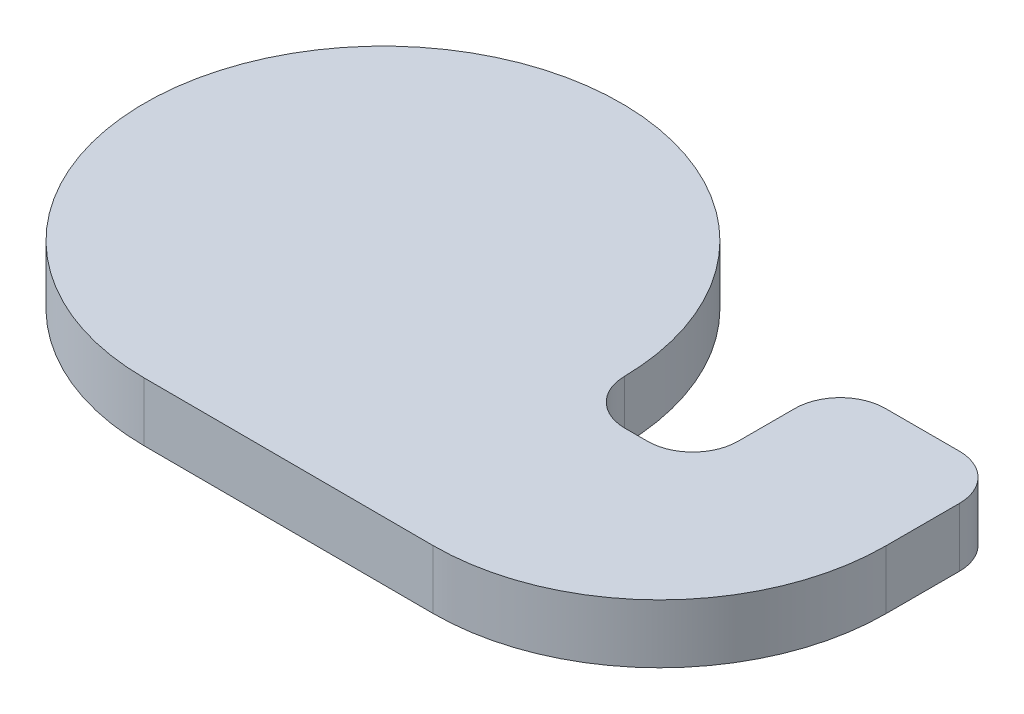
ISO-10303-21;
HEADER;
FILE_DESCRIPTION(('STEP AP214'),'2;1');
FILE_NAME('part.step','',(''),(''),'','','');
FILE_SCHEMA(('AUTOMOTIVE_DESIGN { 1 0 10303 214 1 1 1 1 }'));
ENDSEC;
DATA;
#1=APPLICATION_CONTEXT('core data for automotive mechanical design processes');
#2=APPLICATION_PROTOCOL_DEFINITION('international standard','automotive_design',2000,#1);
#3=PRODUCT_CONTEXT('',#1,'mechanical');
#4=PRODUCT('Part','Part','',(#3));
#5=PRODUCT_RELATED_PRODUCT_CATEGORY('part','',(#4));
#6=PRODUCT_DEFINITION_FORMATION('','',#4);
#7=PRODUCT_DEFINITION_CONTEXT('part definition',#1,'design');
#8=PRODUCT_DEFINITION('design','',#6,#7);
#9=PRODUCT_DEFINITION_SHAPE('','',#8);
#10=(LENGTH_UNIT() NAMED_UNIT(*) SI_UNIT(.MILLI.,.METRE.));
#11=(NAMED_UNIT(*) PLANE_ANGLE_UNIT() SI_UNIT($,.RADIAN.));
#12=(NAMED_UNIT(*) SI_UNIT($,.STERADIAN.) SOLID_ANGLE_UNIT());
#13=UNCERTAINTY_MEASURE_WITH_UNIT(LENGTH_MEASURE(1.E-05),#10,'distance_accuracy_value','');
#14=(GEOMETRIC_REPRESENTATION_CONTEXT(3) GLOBAL_UNCERTAINTY_ASSIGNED_CONTEXT((#13)) GLOBAL_UNIT_ASSIGNED_CONTEXT((#10,
#11,#12)) REPRESENTATION_CONTEXT('',''));
#15=CARTESIAN_POINT('',(0.,0.,0.));
#16=DIRECTION('',(0.,0.,1.));
#17=DIRECTION('',(1.,0.,0.));
#18=AXIS2_PLACEMENT_3D('',#15,#16,#17);
#19=CARTESIAN_POINT('',(37.3962325360071,-2.8,1.83338002798846));
#20=DIRECTION('',(0.,0.,1.));
#21=DIRECTION('',(1.,0.,0.));
#22=AXIS2_PLACEMENT_3D('',#19,#20,#21);
#23=PLANE('',#22);
#24=DIRECTION('',(1.,0.,0.));
#25=VECTOR('',#24,1.);
#26=CARTESIAN_POINT('',(37.3962325360071,-0.2,1.83338002798846));
#27=LINE('',#26,#25);
#28=CARTESIAN_POINT('',(37.3962325360071,-0.2,1.83338002798846));
#29=VERTEX_POINT('',#28);
#30=CARTESIAN_POINT('',(38.3933171153571,-0.2,1.83338002798846));
#31=VERTEX_POINT('',#30);
#32=EDGE_CURVE('E147',#29,#31,#27,.T.);
#33=ORIENTED_EDGE('',*,*,#32,.T.);
#34=DIRECTION('',(0.,1.,0.));
#35=VECTOR('',#34,1.);
#36=CARTESIAN_POINT('',(38.3933171153571,-2.8,1.83338002798846));
#37=LINE('',#36,#35);
#38=CARTESIAN_POINT('',(38.3933171153571,-2.8,1.83338002798846));
#39=VERTEX_POINT('',#38);
#40=EDGE_CURVE('E11',#39,#31,#37,.T.);
#41=ORIENTED_EDGE('',*,*,#40,.F.);
#42=DIRECTION('',(1.,0.,0.));
#43=VECTOR('',#42,1.);
#44=CARTESIAN_POINT('',(37.3962325360071,-2.8,1.83338002798846));
#45=LINE('',#44,#43);
#46=CARTESIAN_POINT('',(37.3962325360071,-2.8,1.83338002798846));
#47=VERTEX_POINT('',#46);
#48=EDGE_CURVE('E171',#47,#39,#45,.T.);
#49=ORIENTED_EDGE('',*,*,#48,.F.);
#50=DIRECTION('',(0.,1.,0.));
#51=VECTOR('',#50,1.);
#52=CARTESIAN_POINT('',(37.3962325360071,-2.8,1.83338002798846));
#53=LINE('',#52,#51);
#54=EDGE_CURVE('E49',#47,#29,#53,.T.);
#55=ORIENTED_EDGE('',*,*,#54,.T.);
#56=EDGE_LOOP('',(#33,#41,#49,#55));
#57=FACE_BOUND('',#56,.T.);
#58=ADVANCED_FACE('F33',(#57),#23,.F.);
#59=CARTESIAN_POINT('',(38.3933171153572,-2.8,-0.166619972011536));
#60=DIRECTION('',(0.,1.,0.));
#61=DIRECTION('',(0.,0.,1.));
#62=AXIS2_PLACEMENT_3D('',#59,#60,#61);
#63=CYLINDRICAL_SURFACE('',#62,2.);
#64=CARTESIAN_POINT('',(38.3933171153572,-0.2,-0.166619972011536));
#65=DIRECTION('',(0.,1.,0.));
#66=DIRECTION('',(0.,0.,1.));
#67=AXIS2_PLACEMENT_3D('',#64,#65,#66);
#68=CIRCLE('',#67,2.);
#69=CARTESIAN_POINT('',(40.3933171153572,-0.2,-0.16661997201155));
#70=VERTEX_POINT('',#69);
#71=EDGE_CURVE('E149',#31,#70,#68,.T.);
#72=ORIENTED_EDGE('',*,*,#71,.T.);
#73=DIRECTION('',(0.,1.,0.));
#74=VECTOR('',#73,1.);
#75=CARTESIAN_POINT('',(40.3933171153572,-2.8,-0.16661997201155));
#76=LINE('',#75,#74);
#77=CARTESIAN_POINT('',(40.3933171153572,-2.8,-0.16661997201155));
#78=VERTEX_POINT('',#77);
#79=EDGE_CURVE('E41',#78,#70,#76,.T.);
#80=ORIENTED_EDGE('',*,*,#79,.F.);
#81=CARTESIAN_POINT('',(38.3933171153572,-2.8,-0.166619972011536));
#82=DIRECTION('',(0.,1.,0.));
#83=DIRECTION('',(0.,0.,1.));
#84=AXIS2_PLACEMENT_3D('',#81,#82,#83);
#85=CIRCLE('',#84,2.);
#86=EDGE_CURVE('E96',#39,#78,#85,.T.);
#87=ORIENTED_EDGE('',*,*,#86,.F.);
#88=ORIENTED_EDGE('',*,*,#40,.T.);
#89=EDGE_LOOP('',(#72,#80,#87,#88));
#90=FACE_BOUND('',#89,.T.);
#91=ADVANCED_FACE('F234',(#90),#63,.F.);
#92=CARTESIAN_POINT('',(40.3933171153572,-2.8,-0.16661997201155));
#93=DIRECTION('',(1.,0.,0.));
#94=DIRECTION('',(0.,0.,-1.));
#95=AXIS2_PLACEMENT_3D('',#92,#93,#94);
#96=PLANE('',#95);
#97=DIRECTION('',(0.,0.,-1.));
#98=VECTOR('',#97,1.);
#99=CARTESIAN_POINT('',(40.3933171153572,-0.2,-0.16661997201155));
#100=LINE('',#99,#98);
#101=CARTESIAN_POINT('',(40.3933171153572,-0.2,-2.68092068018292));
#102=VERTEX_POINT('',#101);
#103=EDGE_CURVE('E151',#70,#102,#100,.T.);
#104=ORIENTED_EDGE('',*,*,#103,.T.);
#105=DIRECTION('',(0.,1.,0.));
#106=VECTOR('',#105,1.);
#107=CARTESIAN_POINT('',(40.3933171153572,-2.8,-2.68092068018292));
#108=LINE('',#107,#106);
#109=CARTESIAN_POINT('',(40.3933171153572,-2.8,-2.68092068018292));
#110=VERTEX_POINT('',#109);
#111=EDGE_CURVE('E186',#110,#102,#108,.T.);
#112=ORIENTED_EDGE('',*,*,#111,.F.);
#113=DIRECTION('',(0.,0.,-1.));
#114=VECTOR('',#113,1.);
#115=CARTESIAN_POINT('',(40.3933171153572,-2.8,-0.16661997201155));
#116=LINE('',#115,#114);
#117=EDGE_CURVE('E194',#78,#110,#116,.T.);
#118=ORIENTED_EDGE('',*,*,#117,.F.);
#119=ORIENTED_EDGE('',*,*,#79,.T.);
#120=EDGE_LOOP('',(#104,#112,#118,#119));
#121=FACE_BOUND('',#120,.T.);
#122=ADVANCED_FACE('F192',(#121),#96,.F.);
#123=CARTESIAN_POINT('',(42.3933171153572,-2.8,-2.68092068018294));
#124=DIRECTION('',(0.,1.,0.));
#125=DIRECTION('',(0.,0.,1.));
#126=AXIS2_PLACEMENT_3D('',#123,#124,#125);
#127=CYLINDRICAL_SURFACE('',#126,2.);
#128=CARTESIAN_POINT('',(42.3933171153572,-0.2,-2.68092068018294));
#129=DIRECTION('',(0.,-1.,0.));
#130=DIRECTION('',(0.,0.,-1.));
#131=AXIS2_PLACEMENT_3D('',#128,#129,#130);
#132=CIRCLE('',#131,2.);
#133=CARTESIAN_POINT('',(42.3933171153572,-0.2,-4.68092068018294));
#134=VERTEX_POINT('',#133);
#135=EDGE_CURVE('E153',#102,#134,#132,.T.);
#136=ORIENTED_EDGE('',*,*,#135,.T.);
#137=DIRECTION('',(0.,1.,0.));
#138=VECTOR('',#137,1.);
#139=CARTESIAN_POINT('',(42.3933171153572,-2.8,-4.68092068018294));
#140=LINE('',#139,#138);
#141=CARTESIAN_POINT('',(42.3933171153572,-2.8,-4.68092068018294));
#142=VERTEX_POINT('',#141);
#143=EDGE_CURVE('E183',#142,#134,#140,.T.);
#144=ORIENTED_EDGE('',*,*,#143,.F.);
#145=CARTESIAN_POINT('',(42.3933171153572,-2.8,-2.68092068018294));
#146=DIRECTION('',(0.,-1.,0.));
#147=DIRECTION('',(0.,0.,-1.));
#148=AXIS2_PLACEMENT_3D('',#145,#146,#147);
#149=CIRCLE('',#148,2.);
#150=EDGE_CURVE('E211',#110,#142,#149,.T.);
#151=ORIENTED_EDGE('',*,*,#150,.F.);
#152=ORIENTED_EDGE('',*,*,#111,.T.);
#153=EDGE_LOOP('',(#136,#144,#151,#152));
#154=FACE_BOUND('',#153,.T.);
#155=ADVANCED_FACE('F202',(#154),#127,.T.);
#156=CARTESIAN_POINT('',(42.3933171153572,-2.8,-4.68092068018294));
#157=DIRECTION('',(0.,0.,1.));
#158=DIRECTION('',(1.,0.,0.));
#159=AXIS2_PLACEMENT_3D('',#156,#157,#158);
#160=PLANE('',#159);
#161=DIRECTION('',(1.,0.,0.));
#162=VECTOR('',#161,1.);
#163=CARTESIAN_POINT('',(42.3933171153572,-0.2,-4.68092068018294));
#164=LINE('',#163,#162);
#165=CARTESIAN_POINT('',(45.6634384394627,-0.2,-4.68092068018294));
#166=VERTEX_POINT('',#165);
#167=EDGE_CURVE('E155',#134,#166,#164,.T.);
#168=ORIENTED_EDGE('',*,*,#167,.T.);
#169=DIRECTION('',(0.,1.,0.));
#170=VECTOR('',#169,1.);
#171=CARTESIAN_POINT('',(45.6634384394627,-2.8,-4.68092068018294));
#172=LINE('',#171,#170);
#173=CARTESIAN_POINT('',(45.6634384394627,-2.8,-4.68092068018294));
#174=VERTEX_POINT('',#173);
#175=EDGE_CURVE('E180',#174,#166,#172,.T.);
#176=ORIENTED_EDGE('',*,*,#175,.F.);
#177=DIRECTION('',(1.,0.,0.));
#178=VECTOR('',#177,1.);
#179=CARTESIAN_POINT('',(42.3933171153572,-2.8,-4.68092068018294));
#180=LINE('',#179,#178);
#181=EDGE_CURVE('E208',#142,#174,#180,.T.);
#182=ORIENTED_EDGE('',*,*,#181,.F.);
#183=ORIENTED_EDGE('',*,*,#143,.T.);
#184=EDGE_LOOP('',(#168,#176,#182,#183));
#185=FACE_BOUND('',#184,.T.);
#186=ADVANCED_FACE('F206',(#185),#160,.F.);
#187=CARTESIAN_POINT('',(45.6634384394627,-2.8,-2.68092068018294));
#188=DIRECTION('',(0.,1.,0.));
#189=DIRECTION('',(0.,0.,1.));
#190=AXIS2_PLACEMENT_3D('',#187,#188,#189);
#191=CYLINDRICAL_SURFACE('',#190,2.);
#192=CARTESIAN_POINT('',(45.6634384394627,-0.2,-2.68092068018294));
#193=DIRECTION('',(0.,-1.,0.));
#194=DIRECTION('',(0.,0.,-1.));
#195=AXIS2_PLACEMENT_3D('',#192,#193,#194);
#196=CIRCLE('',#195,2.);
#197=CARTESIAN_POINT('',(47.6634384394627,-0.2,-2.68092068018292));
#198=VERTEX_POINT('',#197);
#199=EDGE_CURVE('E157',#166,#198,#196,.T.);
#200=ORIENTED_EDGE('',*,*,#199,.T.);
#201=DIRECTION('',(0.,1.,0.));
#202=VECTOR('',#201,1.);
#203=CARTESIAN_POINT('',(47.6634384394627,-2.8,-2.68092068018292));
#204=LINE('',#203,#202);
#205=CARTESIAN_POINT('',(47.6634384394627,-2.8,-2.68092068018292));
#206=VERTEX_POINT('',#205);
#207=EDGE_CURVE('E177',#206,#198,#204,.T.);
#208=ORIENTED_EDGE('',*,*,#207,.F.);
#209=CARTESIAN_POINT('',(45.6634384394627,-2.8,-2.68092068018294));
#210=DIRECTION('',(0.,-1.,0.));
#211=DIRECTION('',(0.,0.,-1.));
#212=AXIS2_PLACEMENT_3D('',#209,#210,#211);
#213=CIRCLE('',#212,2.);
#214=EDGE_CURVE('E210',#174,#206,#213,.T.);
#215=ORIENTED_EDGE('',*,*,#214,.F.);
#216=ORIENTED_EDGE('',*,*,#175,.T.);
#217=EDGE_LOOP('',(#200,#208,#215,#216));
#218=FACE_BOUND('',#217,.T.);
#219=ADVANCED_FACE('F250',(#218),#191,.T.);
#220=CARTESIAN_POINT('',(47.6634384394627,-2.8,-2.68092068018292));
#221=DIRECTION('',(-1.,0.,0.));
#222=DIRECTION('',(0.,0.,1.));
#223=AXIS2_PLACEMENT_3D('',#220,#221,#222);
#224=PLANE('',#223);
#225=DIRECTION('',(0.,0.,1.));
#226=VECTOR('',#225,1.);
#227=CARTESIAN_POINT('',(47.6634384394627,-0.2,-2.68092068018292));
#228=LINE('',#227,#226);
#229=CARTESIAN_POINT('',(47.6634384394627,-0.2,0.56581777710763));
#230=VERTEX_POINT('',#229);
#231=EDGE_CURVE('E159',#198,#230,#228,.T.);
#232=ORIENTED_EDGE('',*,*,#231,.T.);
#233=DIRECTION('',(0.,1.,0.));
#234=VECTOR('',#233,1.);
#235=CARTESIAN_POINT('',(47.6634384394627,-2.8,0.56581777710763));
#236=LINE('',#235,#234);
#237=CARTESIAN_POINT('',(47.6634384394627,-2.8,0.56581777710763));
#238=VERTEX_POINT('',#237);
#239=EDGE_CURVE('E175',#238,#230,#236,.T.);
#240=ORIENTED_EDGE('',*,*,#239,.F.);
#241=DIRECTION('',(0.,0.,1.));
#242=VECTOR('',#241,1.);
#243=CARTESIAN_POINT('',(47.6634384394627,-2.8,-2.68092068018292));
#244=LINE('',#243,#242);
#245=EDGE_CURVE('E213',#206,#238,#244,.T.);
#246=ORIENTED_EDGE('',*,*,#245,.F.);
#247=ORIENTED_EDGE('',*,*,#207,.T.);
#248=EDGE_LOOP('',(#232,#240,#246,#247));
#249=FACE_BOUND('',#248,.T.);
#250=ADVANCED_FACE('F253',(#249),#224,.F.);
#251=CARTESIAN_POINT('',(37.6634384394627,-2.8,0.565817777107701));
#252=DIRECTION('',(0.,1.,0.));
#253=DIRECTION('',(0.,0.,1.));
#254=AXIS2_PLACEMENT_3D('',#251,#252,#253);
#255=CYLINDRICAL_SURFACE('',#254,10.);
#256=CARTESIAN_POINT('',(37.6634384394627,-0.2,0.565817777107701));
#257=DIRECTION('',(0.,1.,0.));
#258=DIRECTION('',(0.,0.,1.));
#259=AXIS2_PLACEMENT_3D('',#256,#257,#258);
#260=CIRCLE('',#259,10.);
#261=CARTESIAN_POINT('',(37.6379759167613,-0.2,10.565785360052));
#262=VERTEX_POINT('',#261);
#263=EDGE_CURVE('E162',#262,#230,#260,.T.);
#264=ORIENTED_EDGE('',*,*,#263,.F.);
#265=DIRECTION('',(0.,1.,0.));
#266=VECTOR('',#265,1.);
#267=CARTESIAN_POINT('',(37.6379759167613,-2.8,10.565785360052));
#268=LINE('',#267,#266);
#269=CARTESIAN_POINT('',(37.6379759167613,-2.8,10.565785360052));
#270=VERTEX_POINT('',#269);
#271=EDGE_CURVE('E130',#270,#262,#268,.T.);
#272=ORIENTED_EDGE('',*,*,#271,.F.);
#273=CARTESIAN_POINT('',(37.6634384394627,-2.8,0.565817777107701));
#274=DIRECTION('',(0.,1.,0.));
#275=DIRECTION('',(0.,0.,1.));
#276=AXIS2_PLACEMENT_3D('',#273,#274,#275);
#277=CIRCLE('',#276,10.);
#278=EDGE_CURVE('E139',#270,#238,#277,.T.);
#279=ORIENTED_EDGE('',*,*,#278,.T.);
#280=ORIENTED_EDGE('',*,*,#239,.T.);
#281=EDGE_LOOP('',(#264,#272,#279,#280));
#282=FACE_BOUND('',#281,.T.);
#283=ADVANCED_FACE('F220',(#282),#255,.T.);
#284=CARTESIAN_POINT('',(24.8372942447131,-2.8,10.5331914896255));
#285=DIRECTION('',(-0.00254625227014109,0.,0.999996758294434));
#286=DIRECTION('',(0.999996758294434,0.,0.00254625227014109));
#287=AXIS2_PLACEMENT_3D('',#284,#285,#286);
#288=PLANE('',#287);
#289=DIRECTION('',(0.999996758294434,0.,0.00254625227014109));
#290=VECTOR('',#289,1.);
#291=CARTESIAN_POINT('',(24.8372942447131,-0.2,10.5331914896255));
#292=LINE('',#291,#290);
#293=CARTESIAN_POINT('',(24.8372942447131,-0.2,10.5331914896255));
#294=VERTEX_POINT('',#293);
#295=EDGE_CURVE('E126',#294,#262,#292,.T.);
#296=ORIENTED_EDGE('',*,*,#295,.F.);
#297=DIRECTION('',(0.,1.,0.));
#298=VECTOR('',#297,1.);
#299=CARTESIAN_POINT('',(24.8372942447131,-2.8,10.5331914896255));
#300=LINE('',#299,#298);
#301=CARTESIAN_POINT('',(24.8372942447131,-2.8,10.5331914896255));
#302=VERTEX_POINT('',#301);
#303=EDGE_CURVE('E121',#302,#294,#300,.T.);
#304=ORIENTED_EDGE('',*,*,#303,.F.);
#305=DIRECTION('',(0.999996758294434,0.,0.00254625227014109));
#306=VECTOR('',#305,1.);
#307=CARTESIAN_POINT('',(24.8372942447131,-2.8,10.5331914896255));
#308=LINE('',#307,#306);
#309=EDGE_CURVE('E124',#302,#270,#308,.T.);
#310=ORIENTED_EDGE('',*,*,#309,.T.);
#311=ORIENTED_EDGE('',*,*,#271,.T.);
#312=EDGE_LOOP('',(#296,#304,#310,#311));
#313=FACE_BOUND('',#312,.T.);
#314=ADVANCED_FACE('F123',(#313),#288,.T.);
#315=CARTESIAN_POINT('',(24.8641144943987,-2.8,0.));
#316=DIRECTION('',(0.,1.,0.));
#317=DIRECTION('',(0.,0.,1.));
#318=AXIS2_PLACEMENT_3D('',#315,#316,#317);
#319=CYLINDRICAL_SURFACE('',#318,10.5332256352417);
#320=CARTESIAN_POINT('',(24.8641144943987,-0.2,0.));
#321=DIRECTION('',(0.,1.,0.));
#322=DIRECTION('',(0.,0.,1.));
#323=AXIS2_PLACEMENT_3D('',#320,#321,#322);
#324=CIRCLE('',#323,10.5332256352417);
#325=CARTESIAN_POINT('',(35.3964092811907,-0.2,-0.140031450132057));
#326=VERTEX_POINT('',#325);
#327=EDGE_CURVE('E166',#326,#294,#324,.T.);
#328=ORIENTED_EDGE('',*,*,#327,.F.);
#329=DIRECTION('',(0.,1.,0.));
#330=VECTOR('',#329,1.);
#331=CARTESIAN_POINT('',(35.3964092811907,-2.8,-0.140031450132057));
#332=LINE('',#331,#330);
#333=CARTESIAN_POINT('',(35.3964092811907,-2.8,-0.140031450132057));
#334=VERTEX_POINT('',#333);
#335=EDGE_CURVE('E84',#334,#326,#332,.T.);
#336=ORIENTED_EDGE('',*,*,#335,.F.);
#337=CARTESIAN_POINT('',(24.8641144943987,-2.8,0.));
#338=DIRECTION('',(0.,1.,0.));
#339=DIRECTION('',(0.,0.,1.));
#340=AXIS2_PLACEMENT_3D('',#337,#338,#339);
#341=CIRCLE('',#340,10.5332256352417);
#342=EDGE_CURVE('E137',#334,#302,#341,.T.);
#343=ORIENTED_EDGE('',*,*,#342,.T.);
#344=ORIENTED_EDGE('',*,*,#303,.T.);
#345=EDGE_LOOP('',(#328,#336,#343,#344));
#346=FACE_BOUND('',#345,.T.);
#347=ADVANCED_FACE('F141',(#346),#319,.T.);
#348=CARTESIAN_POINT('',(37.3962325360071,-2.8,-0.166619972011537));
#349=DIRECTION('',(0.,1.,0.));
#350=DIRECTION('',(0.,0.,1.));
#351=AXIS2_PLACEMENT_3D('',#348,#349,#350);
#352=CYLINDRICAL_SURFACE('',#351,2.);
#353=CARTESIAN_POINT('',(37.3962325360071,-0.2,-0.166619972011537));
#354=DIRECTION('',(0.,-1.,0.));
#355=DIRECTION('',(0.,0.,-1.));
#356=AXIS2_PLACEMENT_3D('',#353,#354,#355);
#357=CIRCLE('',#356,2.);
#358=EDGE_CURVE('E168',#29,#326,#357,.T.);
#359=ORIENTED_EDGE('',*,*,#358,.F.);
#360=ORIENTED_EDGE('',*,*,#54,.F.);
#361=CARTESIAN_POINT('',(37.3962325360071,-2.8,-0.166619972011537));
#362=DIRECTION('',(0.,-1.,0.));
#363=DIRECTION('',(0.,0.,-1.));
#364=AXIS2_PLACEMENT_3D('',#361,#362,#363);
#365=CIRCLE('',#364,2.);
#366=EDGE_CURVE('E142',#47,#334,#365,.T.);
#367=ORIENTED_EDGE('',*,*,#366,.T.);
#368=ORIENTED_EDGE('',*,*,#335,.T.);
#369=EDGE_LOOP('',(#359,#360,#367,#368));
#370=FACE_BOUND('',#369,.T.);
#371=ADVANCED_FACE('F223',(#370),#352,.F.);
#372=CARTESIAN_POINT('',(38.3933171153572,-2.8,-0.166619972011536));
#373=DIRECTION('',(0.,1.,0.));
#374=DIRECTION('',(0.,0.,1.));
#375=AXIS2_PLACEMENT_3D('',#372,#373,#374);
#376=PLANE('',#375);
#377=ORIENTED_EDGE('',*,*,#48,.T.);
#378=ORIENTED_EDGE('',*,*,#86,.T.);
#379=ORIENTED_EDGE('',*,*,#117,.T.);
#380=ORIENTED_EDGE('',*,*,#150,.T.);
#381=ORIENTED_EDGE('',*,*,#181,.T.);
#382=ORIENTED_EDGE('',*,*,#214,.T.);
#383=ORIENTED_EDGE('',*,*,#245,.T.);
#384=ORIENTED_EDGE('',*,*,#278,.F.);
#385=ORIENTED_EDGE('',*,*,#309,.F.);
#386=ORIENTED_EDGE('',*,*,#342,.F.);
#387=ORIENTED_EDGE('',*,*,#366,.F.);
#388=EDGE_LOOP('',(#377,#378,#379,#380,#381,#382,#383,#384,#385,#386,#387));
#389=FACE_BOUND('',#388,.T.);
#390=ADVANCED_FACE('F135',(#389),#376,.F.);
#391=CARTESIAN_POINT('',(38.3933171153572,-0.2,-0.166619972011536));
#392=DIRECTION('',(0.,1.,0.));
#393=DIRECTION('',(0.,0.,1.));
#394=AXIS2_PLACEMENT_3D('',#391,#392,#393);
#395=PLANE('',#394);
#396=ORIENTED_EDGE('',*,*,#32,.F.);
#397=ORIENTED_EDGE('',*,*,#358,.T.);
#398=ORIENTED_EDGE('',*,*,#327,.T.);
#399=ORIENTED_EDGE('',*,*,#295,.T.);
#400=ORIENTED_EDGE('',*,*,#263,.T.);
#401=ORIENTED_EDGE('',*,*,#231,.F.);
#402=ORIENTED_EDGE('',*,*,#199,.F.);
#403=ORIENTED_EDGE('',*,*,#167,.F.);
#404=ORIENTED_EDGE('',*,*,#135,.F.);
#405=ORIENTED_EDGE('',*,*,#103,.F.);
#406=ORIENTED_EDGE('',*,*,#71,.F.);
#407=EDGE_LOOP('',(#396,#397,#398,#399,#400,#401,#402,#403,#404,#405,#406));
#408=FACE_BOUND('',#407,.T.);
#409=ADVANCED_FACE('F197',(#408),#395,.T.);
#410=CLOSED_SHELL('',(#58,#91,#122,#155,#186,#219,#250,#283,#314,#347,#371,#390,#409));
#411=MANIFOLD_SOLID_BREP('B2',#410);
#412=ADVANCED_BREP_SHAPE_REPRESENTATION('',(#18,#411),#14);
#413=SHAPE_DEFINITION_REPRESENTATION(#9,#412);
ENDSEC;
END-ISO-10303-21;
